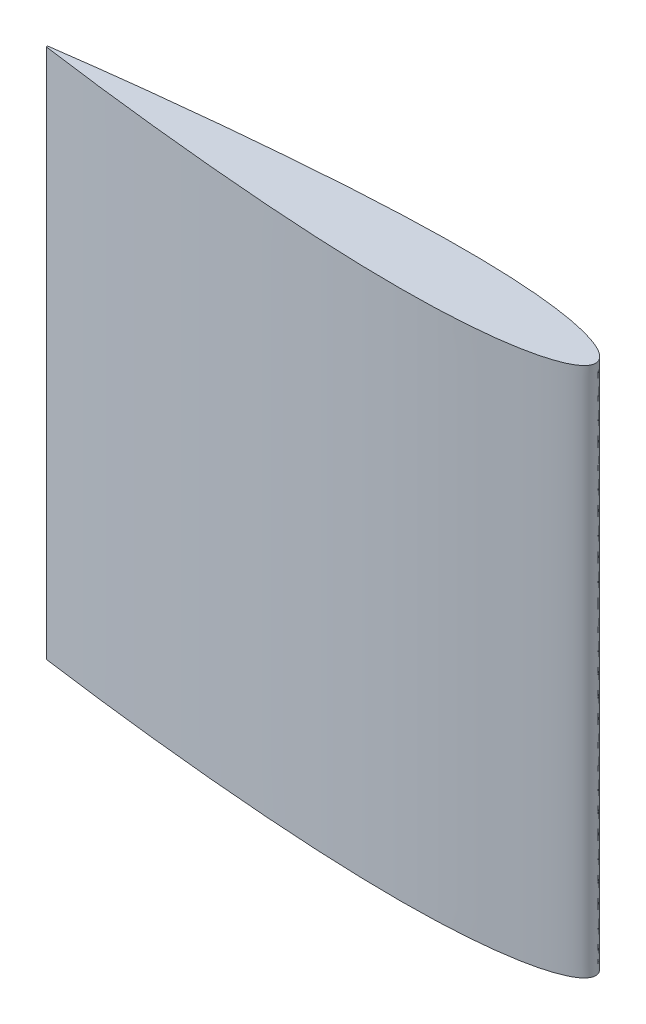
ISO-10303-21;
HEADER;
FILE_DESCRIPTION(('STEP AP214'),'2;1');
FILE_NAME('part.step','',(''),(''),'','','');
FILE_SCHEMA(('AUTOMOTIVE_DESIGN { 1 0 10303 214 1 1 1 1 }'));
ENDSEC;
DATA;
#1=APPLICATION_CONTEXT('core data for automotive mechanical design processes');
#2=APPLICATION_PROTOCOL_DEFINITION('international standard','automotive_design',2000,#1);
#3=PRODUCT_CONTEXT('',#1,'mechanical');
#4=PRODUCT('Part','Part','',(#3));
#5=PRODUCT_RELATED_PRODUCT_CATEGORY('part','',(#4));
#6=PRODUCT_DEFINITION_FORMATION('','',#4);
#7=PRODUCT_DEFINITION_CONTEXT('part definition',#1,'design');
#8=PRODUCT_DEFINITION('design','',#6,#7);
#9=PRODUCT_DEFINITION_SHAPE('','',#8);
#10=(LENGTH_UNIT() NAMED_UNIT(*) SI_UNIT(.MILLI.,.METRE.));
#11=(NAMED_UNIT(*) PLANE_ANGLE_UNIT() SI_UNIT($,.RADIAN.));
#12=(NAMED_UNIT(*) SI_UNIT($,.STERADIAN.) SOLID_ANGLE_UNIT());
#13=UNCERTAINTY_MEASURE_WITH_UNIT(LENGTH_MEASURE(1.E-05),#10,'distance_accuracy_value','');
#14=(GEOMETRIC_REPRESENTATION_CONTEXT(3) GLOBAL_UNCERTAINTY_ASSIGNED_CONTEXT((#13)) GLOBAL_UNIT_ASSIGNED_CONTEXT((#10,
#11,#12)) REPRESENTATION_CONTEXT('',''));
#15=CARTESIAN_POINT('',(0.,0.,0.));
#16=DIRECTION('',(0.,0.,1.));
#17=DIRECTION('',(1.,0.,0.));
#18=AXIS2_PLACEMENT_3D('',#15,#16,#17);
#19=CARTESIAN_POINT('',(-600.,296.120406777929,-0.811000000000007));
#20=CARTESIAN_POINT('',(-597.138302042668,296.120406777929,-0.409042637735767));
#21=CARTESIAN_POINT('',(-586.355085788432,296.120406777929,1.04867668897891));
#22=CARTESIAN_POINT('',(-571.33912880703,296.120406777929,2.83559409597821));
#23=CARTESIAN_POINT('',(-553.404813848227,296.120406777929,4.68467643416197));
#24=CARTESIAN_POINT('',(-539.806277561805,296.120406777929,5.89906081166886));
#25=CARTESIAN_POINT('',(-526.805037998963,296.120406777929,6.85217850163856));
#26=CARTESIAN_POINT('',(-516.027941859503,296.120406777929,7.47876605477489));
#27=CARTESIAN_POINT('',(-505.438137762356,296.120406777929,7.89389329951717));
#28=CARTESIAN_POINT('',(-495.257183984598,296.120406777929,8.05165369532867));
#29=CARTESIAN_POINT('',(-486.642305752459,296.120406777929,7.93013674316121));
#30=CARTESIAN_POINT('',(-479.599508853775,296.120406777929,7.61063408355696));
#31=CARTESIAN_POINT('',(-474.074443318669,296.120406777929,7.20005673606556));
#32=CARTESIAN_POINT('',(-469.023705266486,296.120406777929,6.65158994106573));
#33=CARTESIAN_POINT('',(-465.139380819808,296.120406777929,6.07051337458958));
#34=CARTESIAN_POINT('',(-462.307824514798,296.120406777929,5.53413923805887));
#35=CARTESIAN_POINT('',(-460.395533930217,296.120406777929,5.11538137707377));
#36=CARTESIAN_POINT('',(-458.633849165213,296.120406777929,4.66920756594867));
#37=CARTESIAN_POINT('',(-457.026662993751,296.120406777929,4.1976165894918));
#38=CARTESIAN_POINT('',(-455.577519258724,296.120406777929,3.70217459941527));
#39=CARTESIAN_POINT('',(-454.289508338181,296.120406777929,3.18459274269594));
#40=CARTESIAN_POINT('',(-453.165179908867,296.120406777929,2.64636414567525));
#41=CARTESIAN_POINT('',(-452.206675962751,296.120406777929,2.08860937418706));
#42=CARTESIAN_POINT('',(-451.415112637953,296.120406777929,1.51227393178158));
#43=CARTESIAN_POINT('',(-450.792019449406,296.120406777929,0.916409779418936));
#44=CARTESIAN_POINT('',(-450.338899003667,296.120406777929,0.299328932799702));
#45=CARTESIAN_POINT('',(-450.061860448301,296.120406777929,-0.341984826478774));
#46=CARTESIAN_POINT('',(-449.969846627257,296.120406777929,-0.999999999999729));
#47=CARTESIAN_POINT('',(-450.061860448301,296.120406777929,-1.65801517352069));
#48=CARTESIAN_POINT('',(-450.338899003667,296.120406777929,-2.29932893279926));
#49=CARTESIAN_POINT('',(-450.792019449406,296.120406777929,-2.91640977941845));
#50=CARTESIAN_POINT('',(-451.415112637953,296.120406777929,-3.51227393178108));
#51=CARTESIAN_POINT('',(-452.206675962751,296.120406777929,-4.08860937418649));
#52=CARTESIAN_POINT('',(-453.165179908867,296.120406777929,-4.64636414567475));
#53=CARTESIAN_POINT('',(-454.289508338181,296.120406777929,-5.18459274269536));
#54=CARTESIAN_POINT('',(-455.577519258724,296.120406777929,-5.70217459941473));
#55=CARTESIAN_POINT('',(-457.026662993751,296.120406777929,-6.19761658949127));
#56=CARTESIAN_POINT('',(-458.633849165213,296.120406777929,-6.6692075659482));
#57=CARTESIAN_POINT('',(-460.395533930217,296.120406777929,-7.1153813770732));
#58=CARTESIAN_POINT('',(-463.03409370138,296.120406777929,-7.69317936173226));
#59=CARTESIAN_POINT('',(-466.69087915628,296.120406777929,-8.32859600711514));
#60=CARTESIAN_POINT('',(-471.486795968094,296.120406777929,-8.9424661468429));
#61=CARTESIAN_POINT('',(-477.788242843718,296.120406777929,-9.51427028640799));
#62=CARTESIAN_POINT('',(-485.698184541569,296.120406777929,-9.9164107934316));
#63=CARTESIAN_POINT('',(-496.430894504712,296.120406777929,-10.0682365824225));
#64=CARTESIAN_POINT('',(-507.815667127323,296.120406777929,-9.83281133276142));
#65=CARTESIAN_POINT('',(-519.610575517688,296.120406777929,-9.29093812135523));
#66=CARTESIAN_POINT('',(-530.39997373733,296.120406777929,-8.60498896002973));
#67=CARTESIAN_POINT('',(-542.196364921133,296.120406777929,-7.68917235619855));
#68=CARTESIAN_POINT('',(-552.533079604172,296.120406777929,-6.74934382906959));
#69=CARTESIAN_POINT('',(-565.855225929411,296.120406777929,-5.41366972500033));
#70=CARTESIAN_POINT('',(-579.031667881364,296.120406777929,-3.94005979553412));
#71=CARTESIAN_POINT('',(-591.610591195586,296.120406777929,-2.34216849839578));
#72=CARTESIAN_POINT('',(-597.892701409949,296.120406777929,-1.48398200864058));
#73=CARTESIAN_POINT('',(-599.737670608796,296.120406777929,-1.2258470857879));
#74=CARTESIAN_POINT('',(-600.,296.120406777929,-1.18899999999996));
#75=B_SPLINE_CURVE_WITH_KNOTS('',3,(#19,#20,#21,#22,#23,#24,#25,#26,#27,#28,#29,#30,#31,#32,#33,
#34,#35,#36,#37,#38,#39,#40,#41,#42,#43,#44,#45,#46,#47,#48,#49,#50,#51,#52,#53,#54,#55,#56,#57,
#58,#59,#60,#61,#62,#63,#64,#65,#66,#67,#68,#69,#70,#71,#72,#73,#74),.UNSPECIFIED.,.F.,.F.,(4,1,
1,1,1,1,1,1,1,1,1,1,1,1,1,1,1,1,1,1,1,1,1,1,1,1,1,1,1,1,1,1,1,1,1,1,1,1,1,1,1,1,1,1,1,1,1,1,1,1,
1,1,1,4),(0.,0.0283429008690872,0.106722048517726,0.148306054540842,0.205171366742429,
0.240621400483931,0.276160573352716,0.311047092160121,0.344559265520828,0.376017570419826,
0.395537658905913,0.413698812078543,0.430349273099823,0.445356904422305,0.452209372098903,
0.458611567079498,0.46455404405062,0.470029850192537,0.475034902370301,0.479569141493347,
0.483636857140142,0.487250262770083,0.490431337960153,0.493218828079602,0.495674085869199,
0.497891368316545,0.5,0.502108631683455,0.504325914130801,0.506781171920398,0.509568662039847,
0.512749737229918,0.516363142859858,0.520430858506654,0.524965097629699,0.529970149807464,
0.53544595594938,0.541388432920502,0.547790627901097,0.561933980705176,0.577778558712574,
0.595202023801781,0.623982429580175,0.655440734479173,0.700464146399425,0.735649712925285,
0.771241831243212,0.806495956538878,0.851693945459158,0.873039495246583,0.937813387298575,
0.981728387914688,0.997401830647112,1.),.UNSPECIFIED.);
#76=DIRECTION('',(0.,-1.,0.));
#77=VECTOR('',#76,1.);
#78=SURFACE_OF_LINEAR_EXTRUSION('',#75,#77);
#79=CARTESIAN_POINT('',(-600.,145.,-0.811000000000007));
#80=CARTESIAN_POINT('',(-597.138302042668,145.,-0.409042637735767));
#81=CARTESIAN_POINT('',(-586.355085788432,145.,1.04867668897891));
#82=CARTESIAN_POINT('',(-571.33912880703,145.,2.83559409597821));
#83=CARTESIAN_POINT('',(-553.404813848227,145.,4.68467643416197));
#84=CARTESIAN_POINT('',(-539.806277561805,145.,5.89906081166886));
#85=CARTESIAN_POINT('',(-526.805037998963,145.,6.85217850163856));
#86=CARTESIAN_POINT('',(-516.027941859503,145.,7.47876605477489));
#87=CARTESIAN_POINT('',(-505.438137762356,145.,7.89389329951717));
#88=CARTESIAN_POINT('',(-495.257183984598,145.,8.05165369532867));
#89=CARTESIAN_POINT('',(-486.642305752459,145.,7.93013674316121));
#90=CARTESIAN_POINT('',(-479.599508853775,145.,7.61063408355696));
#91=CARTESIAN_POINT('',(-474.074443318669,145.,7.20005673606556));
#92=CARTESIAN_POINT('',(-469.023705266486,145.,6.65158994106573));
#93=CARTESIAN_POINT('',(-465.139380819808,145.,6.07051337458958));
#94=CARTESIAN_POINT('',(-462.307824514798,145.,5.53413923805887));
#95=CARTESIAN_POINT('',(-460.395533930217,145.,5.11538137707377));
#96=CARTESIAN_POINT('',(-458.633849165213,145.,4.66920756594867));
#97=CARTESIAN_POINT('',(-457.026662993751,145.,4.1976165894918));
#98=CARTESIAN_POINT('',(-455.577519258724,145.,3.70217459941527));
#99=CARTESIAN_POINT('',(-454.289508338181,145.,3.18459274269594));
#100=CARTESIAN_POINT('',(-453.165179908867,145.,2.64636414567525));
#101=CARTESIAN_POINT('',(-452.206675962751,145.,2.08860937418706));
#102=CARTESIAN_POINT('',(-451.415112637953,145.,1.51227393178158));
#103=CARTESIAN_POINT('',(-450.792019449406,145.,0.916409779418936));
#104=CARTESIAN_POINT('',(-450.338899003667,145.,0.299328932799702));
#105=CARTESIAN_POINT('',(-450.061860448301,145.,-0.341984826478774));
#106=CARTESIAN_POINT('',(-449.969846627257,145.,-0.999999999999729));
#107=CARTESIAN_POINT('',(-450.061860448301,145.,-1.65801517352069));
#108=CARTESIAN_POINT('',(-450.338899003667,145.,-2.29932893279926));
#109=CARTESIAN_POINT('',(-450.792019449406,145.,-2.91640977941845));
#110=CARTESIAN_POINT('',(-451.415112637953,145.,-3.51227393178108));
#111=CARTESIAN_POINT('',(-452.206675962751,145.,-4.08860937418649));
#112=CARTESIAN_POINT('',(-453.165179908867,145.,-4.64636414567475));
#113=CARTESIAN_POINT('',(-454.289508338181,145.,-5.18459274269536));
#114=CARTESIAN_POINT('',(-455.577519258724,145.,-5.70217459941473));
#115=CARTESIAN_POINT('',(-457.026662993751,145.,-6.19761658949127));
#116=CARTESIAN_POINT('',(-458.633849165213,145.,-6.6692075659482));
#117=CARTESIAN_POINT('',(-460.395533930217,145.,-7.1153813770732));
#118=CARTESIAN_POINT('',(-463.03409370138,145.,-7.69317936173226));
#119=CARTESIAN_POINT('',(-466.69087915628,145.,-8.32859600711514));
#120=CARTESIAN_POINT('',(-471.486795968094,145.,-8.9424661468429));
#121=CARTESIAN_POINT('',(-477.788242843718,145.,-9.51427028640799));
#122=CARTESIAN_POINT('',(-485.698184541569,145.,-9.9164107934316));
#123=CARTESIAN_POINT('',(-496.430894504712,145.,-10.0682365824225));
#124=CARTESIAN_POINT('',(-507.815667127323,145.,-9.83281133276142));
#125=CARTESIAN_POINT('',(-519.610575517688,145.,-9.29093812135523));
#126=CARTESIAN_POINT('',(-530.39997373733,145.,-8.60498896002973));
#127=CARTESIAN_POINT('',(-542.196364921133,145.,-7.68917235619855));
#128=CARTESIAN_POINT('',(-552.533079604172,145.,-6.74934382906959));
#129=CARTESIAN_POINT('',(-565.855225929411,145.,-5.41366972500033));
#130=CARTESIAN_POINT('',(-579.031667881364,145.,-3.94005979553412));
#131=CARTESIAN_POINT('',(-591.610591195586,145.,-2.34216849839578));
#132=CARTESIAN_POINT('',(-597.892701409949,145.,-1.48398200864058));
#133=CARTESIAN_POINT('',(-599.737670608796,145.,-1.2258470857879));
#134=CARTESIAN_POINT('',(-600.,145.,-1.18899999999996));
#135=B_SPLINE_CURVE_WITH_KNOTS('',3,(#79,#80,#81,#82,#83,#84,#85,#86,#87,#88,#89,#90,#91,#92,
#93,#94,#95,#96,#97,#98,#99,#100,#101,#102,#103,#104,#105,#106,#107,#108,#109,#110,#111,#112,
#113,#114,#115,#116,#117,#118,#119,#120,#121,#122,#123,#124,#125,#126,#127,#128,#129,#130,#131,
#132,#133,#134),.UNSPECIFIED.,.F.,.F.,(4,1,1,1,1,1,1,1,1,1,1,1,1,1,1,1,1,1,1,1,1,1,1,1,1,1,1,1,
1,1,1,1,1,1,1,1,1,1,1,1,1,1,1,1,1,1,1,1,1,1,1,1,1,4),(0.,0.0283429008690872,0.106722048517726,
0.148306054540842,0.205171366742429,0.240621400483931,0.276160573352716,0.311047092160121,
0.344559265520828,0.376017570419826,0.395537658905913,0.413698812078543,0.430349273099823,
0.445356904422305,0.452209372098903,0.458611567079498,0.46455404405062,0.470029850192537,
0.475034902370301,0.479569141493347,0.483636857140142,0.487250262770083,0.490431337960153,
0.493218828079602,0.495674085869199,0.497891368316545,0.5,0.502108631683455,0.504325914130801,
0.506781171920398,0.509568662039847,0.512749737229918,0.516363142859858,0.520430858506654,
0.524965097629699,0.529970149807464,0.53544595594938,0.541388432920502,0.547790627901097,
0.561933980705176,0.577778558712574,0.595202023801781,0.623982429580175,0.655440734479173,
0.700464146399425,0.735649712925285,0.771241831243212,0.806495956538878,0.851693945459158,
0.873039495246583,0.937813387298575,0.981728387914688,0.997401830647112,1.),.UNSPECIFIED.);
#136=CARTESIAN_POINT('',(-600.,145.,-0.811000000000007));
#137=VERTEX_POINT('',#136);
#138=CARTESIAN_POINT('',(-600.,145.,-1.18899999999996));
#139=VERTEX_POINT('',#138);
#140=EDGE_CURVE('E11',#137,#139,#135,.T.);
#141=ORIENTED_EDGE('',*,*,#140,.F.);
#142=DIRECTION('',(0.,-1.,0.));
#143=VECTOR('',#142,1.);
#144=CARTESIAN_POINT('',(-600.,296.120406777929,-0.811000000000007));
#145=LINE('',#144,#143);
#146=CARTESIAN_POINT('',(-600.,0.,-0.811000000000007));
#147=VERTEX_POINT('',#146);
#148=EDGE_CURVE('E62',#137,#147,#145,.T.);
#149=ORIENTED_EDGE('',*,*,#148,.T.);
#150=CARTESIAN_POINT('',(-600.,0.,-0.811000000000007));
#151=CARTESIAN_POINT('',(-597.138302042668,0.,-0.409042637735767));
#152=CARTESIAN_POINT('',(-586.355085788432,0.,1.04867668897891));
#153=CARTESIAN_POINT('',(-571.33912880703,0.,2.83559409597821));
#154=CARTESIAN_POINT('',(-553.404813848227,0.,4.68467643416197));
#155=CARTESIAN_POINT('',(-539.806277561805,0.,5.89906081166886));
#156=CARTESIAN_POINT('',(-526.805037998963,0.,6.85217850163856));
#157=CARTESIAN_POINT('',(-516.027941859503,0.,7.47876605477489));
#158=CARTESIAN_POINT('',(-505.438137762356,0.,7.89389329951717));
#159=CARTESIAN_POINT('',(-495.257183984598,0.,8.05165369532867));
#160=CARTESIAN_POINT('',(-486.642305752459,0.,7.93013674316121));
#161=CARTESIAN_POINT('',(-479.599508853775,0.,7.61063408355696));
#162=CARTESIAN_POINT('',(-474.074443318669,0.,7.20005673606556));
#163=CARTESIAN_POINT('',(-469.023705266486,0.,6.65158994106573));
#164=CARTESIAN_POINT('',(-465.139380819808,0.,6.07051337458958));
#165=CARTESIAN_POINT('',(-462.307824514798,0.,5.53413923805887));
#166=CARTESIAN_POINT('',(-460.395533930217,0.,5.11538137707377));
#167=CARTESIAN_POINT('',(-458.633849165213,0.,4.66920756594867));
#168=CARTESIAN_POINT('',(-457.026662993751,0.,4.1976165894918));
#169=CARTESIAN_POINT('',(-455.577519258724,0.,3.70217459941527));
#170=CARTESIAN_POINT('',(-454.289508338181,0.,3.18459274269594));
#171=CARTESIAN_POINT('',(-453.165179908867,0.,2.64636414567525));
#172=CARTESIAN_POINT('',(-452.206675962751,0.,2.08860937418706));
#173=CARTESIAN_POINT('',(-451.415112637953,0.,1.51227393178158));
#174=CARTESIAN_POINT('',(-450.792019449406,0.,0.916409779418936));
#175=CARTESIAN_POINT('',(-450.338899003667,0.,0.299328932799702));
#176=CARTESIAN_POINT('',(-450.061860448301,0.,-0.341984826478774));
#177=CARTESIAN_POINT('',(-449.969846627257,0.,-0.999999999999729));
#178=CARTESIAN_POINT('',(-450.061860448301,0.,-1.65801517352069));
#179=CARTESIAN_POINT('',(-450.338899003667,0.,-2.29932893279926));
#180=CARTESIAN_POINT('',(-450.792019449406,0.,-2.91640977941845));
#181=CARTESIAN_POINT('',(-451.415112637953,0.,-3.51227393178108));
#182=CARTESIAN_POINT('',(-452.206675962751,0.,-4.08860937418649));
#183=CARTESIAN_POINT('',(-453.165179908867,0.,-4.64636414567475));
#184=CARTESIAN_POINT('',(-454.289508338181,0.,-5.18459274269536));
#185=CARTESIAN_POINT('',(-455.577519258724,0.,-5.70217459941473));
#186=CARTESIAN_POINT('',(-457.026662993751,0.,-6.19761658949127));
#187=CARTESIAN_POINT('',(-458.633849165213,0.,-6.6692075659482));
#188=CARTESIAN_POINT('',(-460.395533930217,0.,-7.1153813770732));
#189=CARTESIAN_POINT('',(-463.03409370138,0.,-7.69317936173226));
#190=CARTESIAN_POINT('',(-466.69087915628,0.,-8.32859600711514));
#191=CARTESIAN_POINT('',(-471.486795968094,0.,-8.9424661468429));
#192=CARTESIAN_POINT('',(-477.788242843718,0.,-9.51427028640799));
#193=CARTESIAN_POINT('',(-485.698184541569,0.,-9.9164107934316));
#194=CARTESIAN_POINT('',(-496.430894504712,0.,-10.0682365824225));
#195=CARTESIAN_POINT('',(-507.815667127323,0.,-9.83281133276142));
#196=CARTESIAN_POINT('',(-519.610575517688,0.,-9.29093812135523));
#197=CARTESIAN_POINT('',(-530.39997373733,0.,-8.60498896002973));
#198=CARTESIAN_POINT('',(-542.196364921133,0.,-7.68917235619855));
#199=CARTESIAN_POINT('',(-552.533079604172,0.,-6.74934382906959));
#200=CARTESIAN_POINT('',(-565.855225929411,0.,-5.41366972500033));
#201=CARTESIAN_POINT('',(-579.031667881364,0.,-3.94005979553412));
#202=CARTESIAN_POINT('',(-591.610591195586,0.,-2.34216849839578));
#203=CARTESIAN_POINT('',(-597.892701409949,0.,-1.48398200864058));
#204=CARTESIAN_POINT('',(-599.737670608796,0.,-1.2258470857879));
#205=CARTESIAN_POINT('',(-600.,0.,-1.18899999999996));
#206=B_SPLINE_CURVE_WITH_KNOTS('',3,(#150,#151,#152,#153,#154,#155,#156,#157,#158,#159,#160,
#161,#162,#163,#164,#165,#166,#167,#168,#169,#170,#171,#172,#173,#174,#175,#176,#177,#178,#179,
#180,#181,#182,#183,#184,#185,#186,#187,#188,#189,#190,#191,#192,#193,#194,#195,#196,#197,#198,
#199,#200,#201,#202,#203,#204,#205),.UNSPECIFIED.,.F.,.F.,(4,1,1,1,1,1,1,1,1,1,1,1,1,1,1,1,1,1,
1,1,1,1,1,1,1,1,1,1,1,1,1,1,1,1,1,1,1,1,1,1,1,1,1,1,1,1,1,1,1,1,1,1,1,4),(0.,0.0283429008690872,
0.106722048517726,0.148306054540842,0.205171366742429,0.240621400483931,0.276160573352716,
0.311047092160121,0.344559265520828,0.376017570419826,0.395537658905913,0.413698812078543,
0.430349273099823,0.445356904422305,0.452209372098903,0.458611567079498,0.46455404405062,
0.470029850192537,0.475034902370301,0.479569141493347,0.483636857140142,0.487250262770083,
0.490431337960153,0.493218828079602,0.495674085869199,0.497891368316545,0.5,0.502108631683455,
0.504325914130801,0.506781171920398,0.509568662039847,0.512749737229918,0.516363142859858,
0.520430858506654,0.524965097629699,0.529970149807464,0.53544595594938,0.541388432920502,
0.547790627901097,0.561933980705176,0.577778558712574,0.595202023801781,0.623982429580175,
0.655440734479173,0.700464146399425,0.735649712925285,0.771241831243212,0.806495956538878,
0.851693945459158,0.873039495246583,0.937813387298575,0.981728387914688,0.997401830647112,1.),.UNSPECIFIED.);
#207=CARTESIAN_POINT('',(-600.,0.,-1.18899999999996));
#208=VERTEX_POINT('',#207);
#209=EDGE_CURVE('E75',#147,#208,#206,.T.);
#210=ORIENTED_EDGE('',*,*,#209,.T.);
#211=DIRECTION('',(0.,-1.,0.));
#212=VECTOR('',#211,1.);
#213=CARTESIAN_POINT('',(-600.,296.120406777929,-1.18899999999996));
#214=LINE('',#213,#212);
#215=EDGE_CURVE('E67',#139,#208,#214,.T.);
#216=ORIENTED_EDGE('',*,*,#215,.F.);
#217=EDGE_LOOP('',(#141,#149,#210,#216));
#218=FACE_BOUND('',#217,.T.);
#219=ADVANCED_FACE('F43',(#218),#78,.F.);
#220=CARTESIAN_POINT('',(-600.,296.120406777929,-0.811000000000007));
#221=DIRECTION('',(1.,0.,0.));
#222=DIRECTION('',(0.,0.,-1.));
#223=AXIS2_PLACEMENT_3D('',#220,#221,#222);
#224=PLANE('',#223);
#225=DIRECTION('',(0.,0.,1.));
#226=VECTOR('',#225,1.);
#227=CARTESIAN_POINT('',(-600.,145.,-0.811000000000007));
#228=LINE('',#227,#226);
#229=EDGE_CURVE('E54',#139,#137,#228,.T.);
#230=ORIENTED_EDGE('',*,*,#229,.F.);
#231=ORIENTED_EDGE('',*,*,#215,.T.);
#232=DIRECTION('',(0.,0.,1.));
#233=VECTOR('',#232,1.);
#234=CARTESIAN_POINT('',(-600.,0.,-0.811000000000007));
#235=LINE('',#234,#233);
#236=EDGE_CURVE('E77',#208,#147,#235,.T.);
#237=ORIENTED_EDGE('',*,*,#236,.T.);
#238=ORIENTED_EDGE('',*,*,#148,.F.);
#239=EDGE_LOOP('',(#230,#231,#237,#238));
#240=FACE_BOUND('',#239,.T.);
#241=ADVANCED_FACE('F78',(#240),#224,.F.);
#242=CARTESIAN_POINT('',(-450.,0.,-0.999999999999696));
#243=DIRECTION('',(0.,-1.,0.));
#244=DIRECTION('',(0.,0.,-1.));
#245=AXIS2_PLACEMENT_3D('',#242,#243,#244);
#246=PLANE('',#245);
#247=ORIENTED_EDGE('',*,*,#209,.F.);
#248=ORIENTED_EDGE('',*,*,#236,.F.);
#249=EDGE_LOOP('',(#247,#248));
#250=FACE_BOUND('',#249,.T.);
#251=ADVANCED_FACE('F81',(#250),#246,.T.);
#252=CARTESIAN_POINT('',(0.,145.,0.));
#253=DIRECTION('',(0.,1.,0.));
#254=DIRECTION('',(0.,0.,1.));
#255=AXIS2_PLACEMENT_3D('',#252,#253,#254);
#256=PLANE('',#255);
#257=ORIENTED_EDGE('',*,*,#229,.T.);
#258=ORIENTED_EDGE('',*,*,#140,.T.);
#259=EDGE_LOOP('',(#257,#258));
#260=FACE_BOUND('',#259,.T.);
#261=ADVANCED_FACE('F45',(#260),#256,.T.);
#262=CLOSED_SHELL('',(#219,#241,#251,#261));
#263=MANIFOLD_SOLID_BREP('B2',#262);
#264=ADVANCED_BREP_SHAPE_REPRESENTATION('',(#18,#263),#14);
#265=SHAPE_DEFINITION_REPRESENTATION(#9,#264);
ENDSEC;
END-ISO-10303-21;
